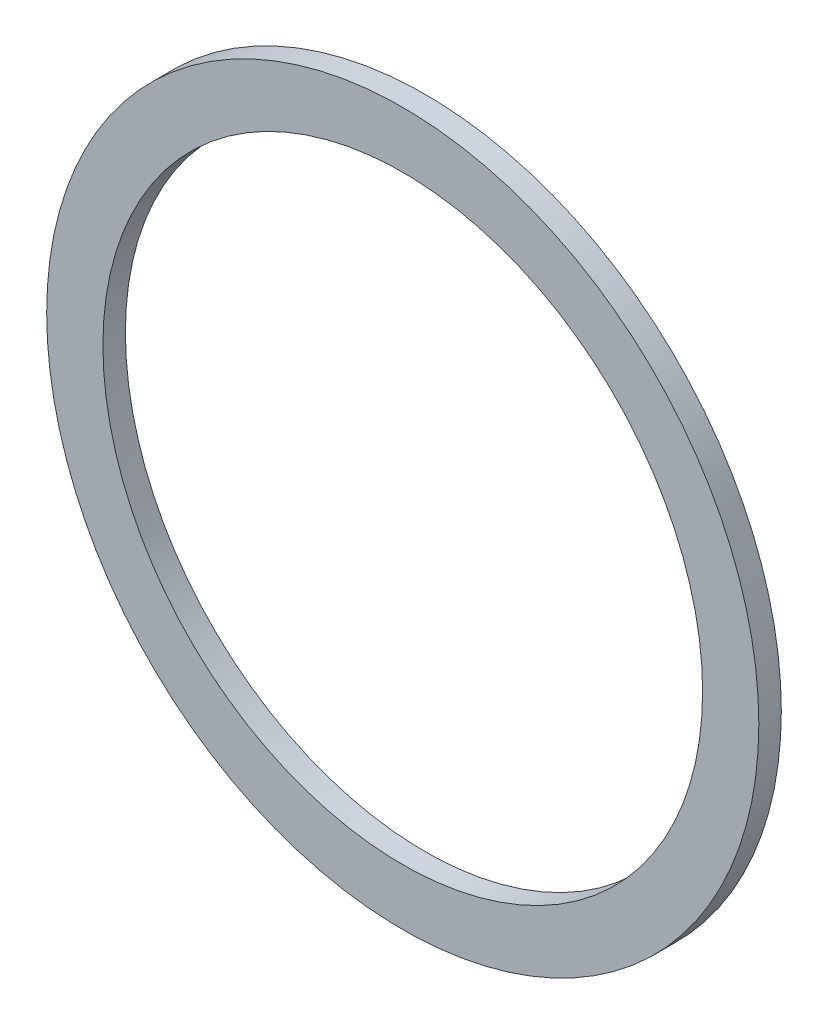
ISO-10303-21;
HEADER;
FILE_DESCRIPTION(('STEP AP214'),'2;1');
FILE_NAME('part.step','',(''),(''),'','','');
FILE_SCHEMA(('AUTOMOTIVE_DESIGN { 1 0 10303 214 1 1 1 1 }'));
ENDSEC;
DATA;
#1=APPLICATION_CONTEXT('core data for automotive mechanical design processes');
#2=APPLICATION_PROTOCOL_DEFINITION('international standard','automotive_design',2000,#1);
#3=PRODUCT_CONTEXT('',#1,'mechanical');
#4=PRODUCT('Part','Part','',(#3));
#5=PRODUCT_RELATED_PRODUCT_CATEGORY('part','',(#4));
#6=PRODUCT_DEFINITION_FORMATION('','',#4);
#7=PRODUCT_DEFINITION_CONTEXT('part definition',#1,'design');
#8=PRODUCT_DEFINITION('design','',#6,#7);
#9=PRODUCT_DEFINITION_SHAPE('','',#8);
#10=(LENGTH_UNIT() NAMED_UNIT(*) SI_UNIT(.MILLI.,.METRE.));
#11=(NAMED_UNIT(*) PLANE_ANGLE_UNIT() SI_UNIT($,.RADIAN.));
#12=(NAMED_UNIT(*) SI_UNIT($,.STERADIAN.) SOLID_ANGLE_UNIT());
#13=UNCERTAINTY_MEASURE_WITH_UNIT(LENGTH_MEASURE(1.E-05),#10,'distance_accuracy_value','');
#14=(GEOMETRIC_REPRESENTATION_CONTEXT(3) GLOBAL_UNCERTAINTY_ASSIGNED_CONTEXT((#13)) GLOBAL_UNIT_ASSIGNED_CONTEXT((#10,
#11,#12)) REPRESENTATION_CONTEXT('',''));
#15=CARTESIAN_POINT('',(0.,0.,0.));
#16=DIRECTION('',(0.,0.,1.));
#17=DIRECTION('',(1.,0.,0.));
#18=AXIS2_PLACEMENT_3D('',#15,#16,#17);
#19=CARTESIAN_POINT('',(240.,0.,309.));
#20=DIRECTION('',(0.,0.,1.));
#21=DIRECTION('',(1.,0.,0.));
#22=AXIS2_PLACEMENT_3D('',#19,#20,#21);
#23=PLANE('',#22);
#24=CARTESIAN_POINT('',(240.,0.,309.));
#25=DIRECTION('',(0.,0.,1.));
#26=DIRECTION('',(1.,0.,0.));
#27=AXIS2_PLACEMENT_3D('',#24,#25,#26);
#28=CIRCLE('',#27,95.);
#29=CARTESIAN_POINT('',(335.,0.,309.));
#30=VERTEX_POINT('',#29);
#31=EDGE_CURVE('E10',#30,#30,#28,.T.);
#32=ORIENTED_EDGE('',*,*,#31,.T.);
#33=EDGE_LOOP('',(#32));
#34=FACE_BOUND('',#33,.T.);
#35=CARTESIAN_POINT('',(240.,0.,309.));
#36=DIRECTION('',(0.,0.,1.));
#37=DIRECTION('',(1.,0.,0.));
#38=AXIS2_PLACEMENT_3D('',#35,#36,#37);
#39=CIRCLE('',#38,80.);
#40=CARTESIAN_POINT('',(320.,0.,309.));
#41=VERTEX_POINT('',#40);
#42=EDGE_CURVE('E48',#41,#41,#39,.T.);
#43=ORIENTED_EDGE('',*,*,#42,.F.);
#44=EDGE_LOOP('',(#43));
#45=FACE_BOUND('',#44,.T.);
#46=ADVANCED_FACE('F40',(#34,#45),#23,.T.);
#47=CARTESIAN_POINT('',(240.,0.,303.));
#48=DIRECTION('',(0.,0.,1.));
#49=DIRECTION('',(1.,0.,0.));
#50=AXIS2_PLACEMENT_3D('',#47,#48,#49);
#51=PLANE('',#50);
#52=CARTESIAN_POINT('',(240.,0.,303.));
#53=DIRECTION('',(0.,0.,1.));
#54=DIRECTION('',(1.,0.,0.));
#55=AXIS2_PLACEMENT_3D('',#52,#53,#54);
#56=CIRCLE('',#55,95.);
#57=CARTESIAN_POINT('',(335.,0.,303.));
#58=VERTEX_POINT('',#57);
#59=EDGE_CURVE('E41',#58,#58,#56,.T.);
#60=ORIENTED_EDGE('',*,*,#59,.F.);
#61=EDGE_LOOP('',(#60));
#62=FACE_BOUND('',#61,.T.);
#63=CARTESIAN_POINT('',(240.,0.,303.));
#64=DIRECTION('',(0.,0.,1.));
#65=DIRECTION('',(1.,0.,0.));
#66=AXIS2_PLACEMENT_3D('',#63,#64,#65);
#67=CIRCLE('',#66,80.);
#68=CARTESIAN_POINT('',(320.,0.,303.));
#69=VERTEX_POINT('',#68);
#70=EDGE_CURVE('E49',#69,#69,#67,.T.);
#71=ORIENTED_EDGE('',*,*,#70,.T.);
#72=EDGE_LOOP('',(#71));
#73=FACE_BOUND('',#72,.T.);
#74=ADVANCED_FACE('F58',(#62,#73),#51,.F.);
#75=CARTESIAN_POINT('',(240.,0.,309.));
#76=DIRECTION('',(0.,0.,-1.));
#77=DIRECTION('',(-1.,0.,0.));
#78=AXIS2_PLACEMENT_3D('',#75,#76,#77);
#79=CYLINDRICAL_SURFACE('',#78,95.);
#80=ORIENTED_EDGE('',*,*,#31,.F.);
#81=EDGE_LOOP('',(#80));
#82=FACE_BOUND('',#81,.T.);
#83=ORIENTED_EDGE('',*,*,#59,.T.);
#84=EDGE_LOOP('',(#83));
#85=FACE_BOUND('',#84,.T.);
#86=ADVANCED_FACE('F39',(#82,#85),#79,.T.);
#87=CARTESIAN_POINT('',(240.,0.,309.));
#88=DIRECTION('',(0.,0.,-1.));
#89=DIRECTION('',(-1.,0.,0.));
#90=AXIS2_PLACEMENT_3D('',#87,#88,#89);
#91=CYLINDRICAL_SURFACE('',#90,80.);
#92=ORIENTED_EDGE('',*,*,#42,.T.);
#93=EDGE_LOOP('',(#92));
#94=FACE_BOUND('',#93,.T.);
#95=ORIENTED_EDGE('',*,*,#70,.F.);
#96=EDGE_LOOP('',(#95));
#97=FACE_BOUND('',#96,.T.);
#98=ADVANCED_FACE('F57',(#94,#97),#91,.F.);
#99=CLOSED_SHELL('',(#46,#74,#86,#98));
#100=MANIFOLD_SOLID_BREP('B2',#99);
#101=ADVANCED_BREP_SHAPE_REPRESENTATION('',(#18,#100),#14);
#102=SHAPE_DEFINITION_REPRESENTATION(#9,#101);
ENDSEC;
END-ISO-10303-21;
